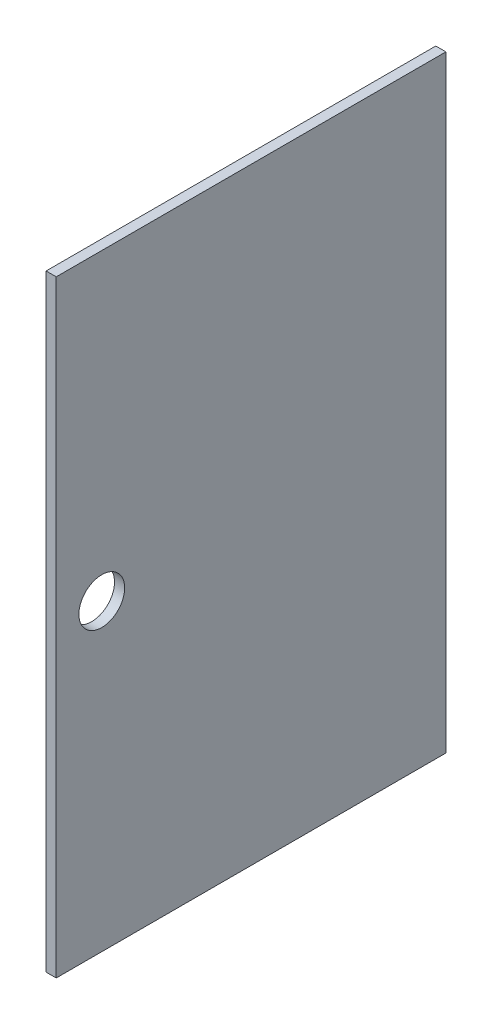
ISO-10303-21;
HEADER;
FILE_DESCRIPTION(('STEP AP214'),'2;1');
FILE_NAME('part.step','',(''),(''),'','','');
FILE_SCHEMA(('AUTOMOTIVE_DESIGN { 1 0 10303 214 1 1 1 1 }'));
ENDSEC;
DATA;
#1=APPLICATION_CONTEXT('core data for automotive mechanical design processes');
#2=APPLICATION_PROTOCOL_DEFINITION('international standard','automotive_design',2000,#1);
#3=PRODUCT_CONTEXT('',#1,'mechanical');
#4=PRODUCT('Part','Part','',(#3));
#5=PRODUCT_RELATED_PRODUCT_CATEGORY('part','',(#4));
#6=PRODUCT_DEFINITION_FORMATION('','',#4);
#7=PRODUCT_DEFINITION_CONTEXT('part definition',#1,'design');
#8=PRODUCT_DEFINITION('design','',#6,#7);
#9=PRODUCT_DEFINITION_SHAPE('','',#8);
#10=(LENGTH_UNIT() NAMED_UNIT(*) SI_UNIT(.MILLI.,.METRE.));
#11=(NAMED_UNIT(*) PLANE_ANGLE_UNIT() SI_UNIT($,.RADIAN.));
#12=(NAMED_UNIT(*) SI_UNIT($,.STERADIAN.) SOLID_ANGLE_UNIT());
#13=UNCERTAINTY_MEASURE_WITH_UNIT(LENGTH_MEASURE(1.E-05),#10,'distance_accuracy_value','');
#14=(GEOMETRIC_REPRESENTATION_CONTEXT(3) GLOBAL_UNCERTAINTY_ASSIGNED_CONTEXT((#13)) GLOBAL_UNIT_ASSIGNED_CONTEXT((#10,
#11,#12)) REPRESENTATION_CONTEXT('',''));
#15=CARTESIAN_POINT('',(0.,0.,0.));
#16=DIRECTION('',(0.,0.,1.));
#17=DIRECTION('',(1.,0.,0.));
#18=AXIS2_PLACEMENT_3D('',#15,#16,#17);
#19=CARTESIAN_POINT('',(6.35,0.,0.));
#20=DIRECTION('',(-1.,0.,0.));
#21=DIRECTION('',(0.,0.,1.));
#22=AXIS2_PLACEMENT_3D('',#19,#20,#21);
#23=PLANE('',#22);
#24=DIRECTION('',(0.,-1.,0.));
#25=VECTOR('',#24,1.);
#26=CARTESIAN_POINT('',(6.35,190.5,122.2375));
#27=LINE('',#26,#25);
#28=CARTESIAN_POINT('',(6.35,190.5,122.2375));
#29=VERTEX_POINT('',#28);
#30=CARTESIAN_POINT('',(6.35,-190.5,122.2375));
#31=VERTEX_POINT('',#30);
#32=EDGE_CURVE('E84',#29,#31,#27,.T.);
#33=ORIENTED_EDGE('',*,*,#32,.T.);
#34=DIRECTION('',(0.,0.,-1.));
#35=VECTOR('',#34,1.);
#36=CARTESIAN_POINT('',(6.35,-190.5,-122.2375));
#37=LINE('',#36,#35);
#38=CARTESIAN_POINT('',(6.35,-190.5,-122.2375));
#39=VERTEX_POINT('',#38);
#40=EDGE_CURVE('E79',#31,#39,#37,.T.);
#41=ORIENTED_EDGE('',*,*,#40,.T.);
#42=DIRECTION('',(0.,1.,0.));
#43=VECTOR('',#42,1.);
#44=CARTESIAN_POINT('',(6.35,190.5,-122.2375));
#45=LINE('',#44,#43);
#46=CARTESIAN_POINT('',(6.35,190.5,-122.2375));
#47=VERTEX_POINT('',#46);
#48=EDGE_CURVE('E82',#39,#47,#45,.T.);
#49=ORIENTED_EDGE('',*,*,#48,.T.);
#50=DIRECTION('',(0.,0.,1.));
#51=VECTOR('',#50,1.);
#52=CARTESIAN_POINT('',(6.35,190.5,-122.2375));
#53=LINE('',#52,#51);
#54=EDGE_CURVE('E49',#47,#29,#53,.T.);
#55=ORIENTED_EDGE('',*,*,#54,.T.);
#56=EDGE_LOOP('',(#33,#41,#49,#55));
#57=FACE_BOUND('',#56,.T.);
#58=CARTESIAN_POINT('',(6.35,0.,93.6625));
#59=DIRECTION('',(1.,0.,0.));
#60=DIRECTION('',(0.,0.,-1.));
#61=AXIS2_PLACEMENT_3D('',#58,#59,#60);
#62=CIRCLE('',#61,14.351);
#63=CARTESIAN_POINT('',(6.35,0.,79.3115));
#64=VERTEX_POINT('',#63);
#65=EDGE_CURVE('E99',#64,#64,#62,.T.);
#66=ORIENTED_EDGE('',*,*,#65,.F.);
#67=EDGE_LOOP('',(#66));
#68=FACE_BOUND('',#67,.T.);
#69=ADVANCED_FACE('F32',(#57,#68),#23,.F.);
#70=CARTESIAN_POINT('',(0.,0.,0.));
#71=DIRECTION('',(-1.,0.,0.));
#72=DIRECTION('',(0.,0.,1.));
#73=AXIS2_PLACEMENT_3D('',#70,#71,#72);
#74=PLANE('',#73);
#75=DIRECTION('',(0.,-1.,0.));
#76=VECTOR('',#75,1.);
#77=CARTESIAN_POINT('',(0.,190.5,122.2375));
#78=LINE('',#77,#76);
#79=CARTESIAN_POINT('',(0.,190.5,122.2375));
#80=VERTEX_POINT('',#79);
#81=CARTESIAN_POINT('',(0.,-190.5,122.2375));
#82=VERTEX_POINT('',#81);
#83=EDGE_CURVE('E96',#80,#82,#78,.T.);
#84=ORIENTED_EDGE('',*,*,#83,.F.);
#85=DIRECTION('',(0.,0.,1.));
#86=VECTOR('',#85,1.);
#87=CARTESIAN_POINT('',(0.,190.5,-122.2375));
#88=LINE('',#87,#86);
#89=CARTESIAN_POINT('',(0.,190.5,-122.2375));
#90=VERTEX_POINT('',#89);
#91=EDGE_CURVE('E72',#90,#80,#88,.T.);
#92=ORIENTED_EDGE('',*,*,#91,.F.);
#93=DIRECTION('',(0.,1.,0.));
#94=VECTOR('',#93,1.);
#95=CARTESIAN_POINT('',(0.,190.5,-122.2375));
#96=LINE('',#95,#94);
#97=CARTESIAN_POINT('',(0.,-190.5,-122.2375));
#98=VERTEX_POINT('',#97);
#99=EDGE_CURVE('E66',#98,#90,#96,.T.);
#100=ORIENTED_EDGE('',*,*,#99,.F.);
#101=DIRECTION('',(0.,0.,-1.));
#102=VECTOR('',#101,1.);
#103=CARTESIAN_POINT('',(0.,-190.5,-122.2375));
#104=LINE('',#103,#102);
#105=EDGE_CURVE('E88',#82,#98,#104,.T.);
#106=ORIENTED_EDGE('',*,*,#105,.F.);
#107=EDGE_LOOP('',(#84,#92,#100,#106));
#108=FACE_BOUND('',#107,.T.);
#109=CARTESIAN_POINT('',(0.,0.,93.6625));
#110=DIRECTION('',(1.,0.,0.));
#111=DIRECTION('',(0.,0.,-1.));
#112=AXIS2_PLACEMENT_3D('',#109,#110,#111);
#113=CIRCLE('',#112,14.351);
#114=CARTESIAN_POINT('',(0.,0.,79.3115));
#115=VERTEX_POINT('',#114);
#116=EDGE_CURVE('E111',#115,#115,#113,.T.);
#117=ORIENTED_EDGE('',*,*,#116,.T.);
#118=EDGE_LOOP('',(#117));
#119=FACE_BOUND('',#118,.T.);
#120=ADVANCED_FACE('F107',(#108,#119),#74,.T.);
#121=CARTESIAN_POINT('',(6.35,190.5,122.2375));
#122=DIRECTION('',(0.,0.,-1.));
#123=DIRECTION('',(0.,1.,0.));
#124=AXIS2_PLACEMENT_3D('',#121,#122,#123);
#125=PLANE('',#124);
#126=ORIENTED_EDGE('',*,*,#83,.T.);
#127=DIRECTION('',(-1.,0.,0.));
#128=VECTOR('',#127,1.);
#129=CARTESIAN_POINT('',(6.35,-190.5,122.2375));
#130=LINE('',#129,#128);
#131=EDGE_CURVE('E11',#31,#82,#130,.T.);
#132=ORIENTED_EDGE('',*,*,#131,.F.);
#133=ORIENTED_EDGE('',*,*,#32,.F.);
#134=DIRECTION('',(-1.,0.,0.));
#135=VECTOR('',#134,1.);
#136=CARTESIAN_POINT('',(6.35,190.5,122.2375));
#137=LINE('',#136,#135);
#138=EDGE_CURVE('E92',#29,#80,#137,.T.);
#139=ORIENTED_EDGE('',*,*,#138,.T.);
#140=EDGE_LOOP('',(#126,#132,#133,#139));
#141=FACE_BOUND('',#140,.T.);
#142=ADVANCED_FACE('F34',(#141),#125,.F.);
#143=CARTESIAN_POINT('',(6.35,-190.5,-122.2375));
#144=DIRECTION('',(0.,1.,0.));
#145=DIRECTION('',(0.,0.,1.));
#146=AXIS2_PLACEMENT_3D('',#143,#144,#145);
#147=PLANE('',#146);
#148=ORIENTED_EDGE('',*,*,#105,.T.);
#149=DIRECTION('',(-1.,0.,0.));
#150=VECTOR('',#149,1.);
#151=CARTESIAN_POINT('',(6.35,-190.5,-122.2375));
#152=LINE('',#151,#150);
#153=EDGE_CURVE('E41',#39,#98,#152,.T.);
#154=ORIENTED_EDGE('',*,*,#153,.F.);
#155=ORIENTED_EDGE('',*,*,#40,.F.);
#156=ORIENTED_EDGE('',*,*,#131,.T.);
#157=EDGE_LOOP('',(#148,#154,#155,#156));
#158=FACE_BOUND('',#157,.T.);
#159=ADVANCED_FACE('F87',(#158),#147,.F.);
#160=CARTESIAN_POINT('',(6.35,190.5,-122.2375));
#161=DIRECTION('',(0.,0.,1.));
#162=DIRECTION('',(0.,-1.,0.));
#163=AXIS2_PLACEMENT_3D('',#160,#161,#162);
#164=PLANE('',#163);
#165=ORIENTED_EDGE('',*,*,#99,.T.);
#166=DIRECTION('',(-1.,0.,0.));
#167=VECTOR('',#166,1.);
#168=CARTESIAN_POINT('',(6.35,190.5,-122.2375));
#169=LINE('',#168,#167);
#170=EDGE_CURVE('E89',#47,#90,#169,.T.);
#171=ORIENTED_EDGE('',*,*,#170,.F.);
#172=ORIENTED_EDGE('',*,*,#48,.F.);
#173=ORIENTED_EDGE('',*,*,#153,.T.);
#174=EDGE_LOOP('',(#165,#171,#172,#173));
#175=FACE_BOUND('',#174,.T.);
#176=ADVANCED_FACE('F90',(#175),#164,.F.);
#177=CARTESIAN_POINT('',(6.35,190.5,-122.2375));
#178=DIRECTION('',(0.,-1.,0.));
#179=DIRECTION('',(0.,0.,-1.));
#180=AXIS2_PLACEMENT_3D('',#177,#178,#179);
#181=PLANE('',#180);
#182=ORIENTED_EDGE('',*,*,#91,.T.);
#183=ORIENTED_EDGE('',*,*,#138,.F.);
#184=ORIENTED_EDGE('',*,*,#54,.F.);
#185=ORIENTED_EDGE('',*,*,#170,.T.);
#186=EDGE_LOOP('',(#182,#183,#184,#185));
#187=FACE_BOUND('',#186,.T.);
#188=ADVANCED_FACE('F104',(#187),#181,.F.);
#189=CARTESIAN_POINT('',(6.35,0.,93.6625));
#190=DIRECTION('',(-1.,0.,0.));
#191=DIRECTION('',(0.,0.,1.));
#192=AXIS2_PLACEMENT_3D('',#189,#190,#191);
#193=CYLINDRICAL_SURFACE('',#192,14.351);
#194=ORIENTED_EDGE('',*,*,#65,.T.);
#195=EDGE_LOOP('',(#194));
#196=FACE_BOUND('',#195,.T.);
#197=ORIENTED_EDGE('',*,*,#116,.F.);
#198=EDGE_LOOP('',(#197));
#199=FACE_BOUND('',#198,.T.);
#200=ADVANCED_FACE('F117',(#196,#199),#193,.F.);
#201=CLOSED_SHELL('',(#69,#120,#142,#159,#176,#188,#200));
#202=MANIFOLD_SOLID_BREP('B2',#201);
#203=ADVANCED_BREP_SHAPE_REPRESENTATION('',(#18,#202),#14);
#204=SHAPE_DEFINITION_REPRESENTATION(#9,#203);
ENDSEC;
END-ISO-10303-21;
